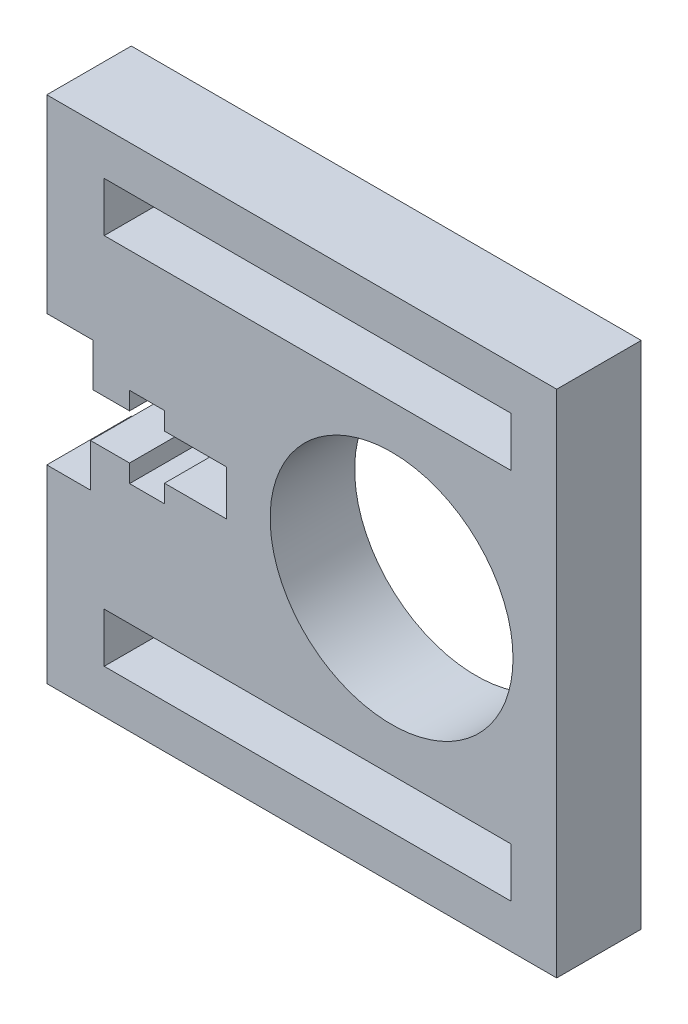
ISO-10303-21;
HEADER;
FILE_DESCRIPTION(('STEP AP214'),'2;1');
FILE_NAME('part.step','',(''),(''),'','','');
FILE_SCHEMA(('AUTOMOTIVE_DESIGN { 1 0 10303 214 1 1 1 1 }'));
ENDSEC;
DATA;
#1=APPLICATION_CONTEXT('core data for automotive mechanical design processes');
#2=APPLICATION_PROTOCOL_DEFINITION('international standard','automotive_design',2000,#1);
#3=PRODUCT_CONTEXT('',#1,'mechanical');
#4=PRODUCT('Part','Part','',(#3));
#5=PRODUCT_RELATED_PRODUCT_CATEGORY('part','',(#4));
#6=PRODUCT_DEFINITION_FORMATION('','',#4);
#7=PRODUCT_DEFINITION_CONTEXT('part definition',#1,'design');
#8=PRODUCT_DEFINITION('design','',#6,#7);
#9=PRODUCT_DEFINITION_SHAPE('','',#8);
#10=(LENGTH_UNIT() NAMED_UNIT(*) SI_UNIT(.MILLI.,.METRE.));
#11=(NAMED_UNIT(*) PLANE_ANGLE_UNIT() SI_UNIT($,.RADIAN.));
#12=(NAMED_UNIT(*) SI_UNIT($,.STERADIAN.) SOLID_ANGLE_UNIT());
#13=UNCERTAINTY_MEASURE_WITH_UNIT(LENGTH_MEASURE(1.E-05),#10,'distance_accuracy_value','');
#14=(GEOMETRIC_REPRESENTATION_CONTEXT(3) GLOBAL_UNCERTAINTY_ASSIGNED_CONTEXT((#13)) GLOBAL_UNIT_ASSIGNED_CONTEXT((#10,
#11,#12)) REPRESENTATION_CONTEXT('',''));
#15=CARTESIAN_POINT('',(0.,0.,0.));
#16=DIRECTION('',(0.,0.,1.));
#17=DIRECTION('',(1.,0.,0.));
#18=AXIS2_PLACEMENT_3D('',#15,#16,#17);
#19=CARTESIAN_POINT('',(0.,0.,5.8));
#20=DIRECTION('',(0.,0.,-1.));
#21=DIRECTION('',(-1.,0.,0.));
#22=AXIS2_PLACEMENT_3D('',#19,#20,#21);
#23=PLANE('',#22);
#24=DIRECTION('',(0.,-1.,0.));
#25=VECTOR('',#24,1.);
#26=CARTESIAN_POINT('',(-13.8445458932748,15.4844401292091,5.8));
#27=LINE('',#26,#25);
#28=CARTESIAN_POINT('',(-13.8445458932748,15.4844401292091,5.8));
#29=VERTEX_POINT('',#28);
#30=CARTESIAN_POINT('',(-13.8445458932748,12.0832558275025,5.8));
#31=VERTEX_POINT('',#30);
#32=EDGE_CURVE('E218',#29,#31,#27,.T.);
#33=ORIENTED_EDGE('',*,*,#32,.F.);
#34=DIRECTION('',(-1.,0.,0.));
#35=VECTOR('',#34,1.);
#36=CARTESIAN_POINT('',(-13.8445458932748,15.4844401292091,5.8));
#37=LINE('',#36,#35);
#38=CARTESIAN_POINT('',(14.0845681553229,15.4844401292091,5.8));
#39=VERTEX_POINT('',#38);
#40=EDGE_CURVE('E241',#39,#29,#37,.T.);
#41=ORIENTED_EDGE('',*,*,#40,.F.);
#42=DIRECTION('',(0.,1.,0.));
#43=VECTOR('',#42,1.);
#44=CARTESIAN_POINT('',(14.0845681553229,15.4844401292091,5.8));
#45=LINE('',#44,#43);
#46=CARTESIAN_POINT('',(14.0845681553229,12.0832558275025,5.8));
#47=VERTEX_POINT('',#46);
#48=EDGE_CURVE('E239',#47,#39,#45,.T.);
#49=ORIENTED_EDGE('',*,*,#48,.F.);
#50=DIRECTION('',(1.,0.,0.));
#51=VECTOR('',#50,1.);
#52=CARTESIAN_POINT('',(-13.8445458932748,12.0832558275025,5.8));
#53=LINE('',#52,#51);
#54=EDGE_CURVE('E226',#31,#47,#53,.T.);
#55=ORIENTED_EDGE('',*,*,#54,.F.);
#56=EDGE_LOOP('',(#33,#41,#49,#55));
#57=FACE_BOUND('',#56,.T.);
#58=DIRECTION('',(0.,1.,0.));
#59=VECTOR('',#58,1.);
#60=CARTESIAN_POINT('',(17.2144243268233,9.08444012920914,5.8));
#61=LINE('',#60,#59);
#62=CARTESIAN_POINT('',(17.2144243268233,9.08444012920914,5.8));
#63=VERTEX_POINT('',#62);
#64=CARTESIAN_POINT('',(17.2144243268233,44.0844401292091,5.8));
#65=VERTEX_POINT('',#64);
#66=EDGE_CURVE('E288',#63,#65,#61,.T.);
#67=ORIENTED_EDGE('',*,*,#66,.T.);
#68=DIRECTION('',(-1.,0.,0.));
#69=VECTOR('',#68,1.);
#70=CARTESIAN_POINT('',(-17.7855756731767,44.0844401292091,5.8));
#71=LINE('',#70,#69);
#72=CARTESIAN_POINT('',(-17.7855756731767,44.0844401292091,5.8));
#73=VERTEX_POINT('',#72);
#74=EDGE_CURVE('E291',#65,#73,#71,.T.);
#75=ORIENTED_EDGE('',*,*,#74,.T.);
#76=DIRECTION('',(0.,-1.,0.));
#77=VECTOR('',#76,1.);
#78=CARTESIAN_POINT('',(-17.7855756731767,31.0844401292091,5.8));
#79=LINE('',#78,#77);
#80=CARTESIAN_POINT('',(-17.7855756731767,31.0844401292091,5.8));
#81=VERTEX_POINT('',#80);
#82=EDGE_CURVE('E294',#73,#81,#79,.T.);
#83=ORIENTED_EDGE('',*,*,#82,.T.);
#84=DIRECTION('',(1.,0.,0.));
#85=VECTOR('',#84,1.);
#86=CARTESIAN_POINT('',(-14.6055756731767,31.0844401292091,5.8));
#87=LINE('',#86,#85);
#88=CARTESIAN_POINT('',(-14.6055756731767,31.0844401292091,5.8));
#89=VERTEX_POINT('',#88);
#90=EDGE_CURVE('E296',#81,#89,#87,.T.);
#91=ORIENTED_EDGE('',*,*,#90,.T.);
#92=DIRECTION('',(0.,-1.,0.));
#93=VECTOR('',#92,1.);
#94=CARTESIAN_POINT('',(-14.6055756731767,28.1322901292091,5.8));
#95=LINE('',#94,#93);
#96=CARTESIAN_POINT('',(-14.6055756731767,28.1322901292091,5.8));
#97=VERTEX_POINT('',#96);
#98=EDGE_CURVE('E298',#89,#97,#95,.T.);
#99=ORIENTED_EDGE('',*,*,#98,.T.);
#100=DIRECTION('',(1.,0.,0.));
#101=VECTOR('',#100,1.);
#102=CARTESIAN_POINT('',(-12.1055756731767,28.1322901292091,5.8));
#103=LINE('',#102,#101);
#104=CARTESIAN_POINT('',(-12.1055756731767,28.1322901292091,5.8));
#105=VERTEX_POINT('',#104);
#106=EDGE_CURVE('E300',#97,#105,#103,.T.);
#107=ORIENTED_EDGE('',*,*,#106,.T.);
#108=DIRECTION('',(0.,1.,0.));
#109=VECTOR('',#108,1.);
#110=CARTESIAN_POINT('',(-12.1055756731767,28.1322901292091,5.8));
#111=LINE('',#110,#109);
#112=CARTESIAN_POINT('',(-12.1055756731767,29.3566901292091,5.8));
#113=VERTEX_POINT('',#112);
#114=EDGE_CURVE('E302',#105,#113,#111,.T.);
#115=ORIENTED_EDGE('',*,*,#114,.T.);
#116=DIRECTION('',(1.,0.,0.));
#117=VECTOR('',#116,1.);
#118=CARTESIAN_POINT('',(-9.7055756731767,29.3566901292091,5.8));
#119=LINE('',#118,#117);
#120=CARTESIAN_POINT('',(-9.7055756731767,29.3566901292091,5.8));
#121=VERTEX_POINT('',#120);
#122=EDGE_CURVE('E304',#113,#121,#119,.T.);
#123=ORIENTED_EDGE('',*,*,#122,.T.);
#124=DIRECTION('',(0.,-1.,0.));
#125=VECTOR('',#124,1.);
#126=CARTESIAN_POINT('',(-9.7055756731767,28.1322901292091,5.8));
#127=LINE('',#126,#125);
#128=CARTESIAN_POINT('',(-9.7055756731767,28.1322901292091,5.8));
#129=VERTEX_POINT('',#128);
#130=EDGE_CURVE('E306',#121,#129,#127,.T.);
#131=ORIENTED_EDGE('',*,*,#130,.T.);
#132=DIRECTION('',(1.,0.,0.));
#133=VECTOR('',#132,1.);
#134=CARTESIAN_POINT('',(-9.7055756731767,28.1322901292091,5.8));
#135=LINE('',#134,#133);
#136=CARTESIAN_POINT('',(-5.45496555029504,28.1322901292091,5.8));
#137=VERTEX_POINT('',#136);
#138=EDGE_CURVE('E308',#129,#137,#135,.T.);
#139=ORIENTED_EDGE('',*,*,#138,.T.);
#140=DIRECTION('',(0.,-1.,0.));
#141=VECTOR('',#140,1.);
#142=CARTESIAN_POINT('',(-5.45496555029504,25.0365901292091,5.8));
#143=LINE('',#142,#141);
#144=CARTESIAN_POINT('',(-5.45496555029504,25.0365901292091,5.8));
#145=VERTEX_POINT('',#144);
#146=EDGE_CURVE('E310',#137,#145,#143,.T.);
#147=ORIENTED_EDGE('',*,*,#146,.T.);
#148=DIRECTION('',(-1.,0.,0.));
#149=VECTOR('',#148,1.);
#150=CARTESIAN_POINT('',(-9.7055756731767,25.0365901292091,5.8));
#151=LINE('',#150,#149);
#152=CARTESIAN_POINT('',(-9.7055756731767,25.0365901292091,5.8));
#153=VERTEX_POINT('',#152);
#154=EDGE_CURVE('E312',#145,#153,#151,.T.);
#155=ORIENTED_EDGE('',*,*,#154,.T.);
#156=DIRECTION('',(0.,-1.,0.));
#157=VECTOR('',#156,1.);
#158=CARTESIAN_POINT('',(-9.7055756731767,25.0365901292091,5.8));
#159=LINE('',#158,#157);
#160=CARTESIAN_POINT('',(-9.7055756731767,23.8121901292091,5.8));
#161=VERTEX_POINT('',#160);
#162=EDGE_CURVE('E314',#153,#161,#159,.T.);
#163=ORIENTED_EDGE('',*,*,#162,.T.);
#164=DIRECTION('',(-1.,0.,0.));
#165=VECTOR('',#164,1.);
#166=CARTESIAN_POINT('',(-9.7055756731767,23.8121901292091,5.8));
#167=LINE('',#166,#165);
#168=CARTESIAN_POINT('',(-12.1055756731767,23.8121901292091,5.8));
#169=VERTEX_POINT('',#168);
#170=EDGE_CURVE('E316',#161,#169,#167,.T.);
#171=ORIENTED_EDGE('',*,*,#170,.T.);
#172=DIRECTION('',(0.,1.,0.));
#173=VECTOR('',#172,1.);
#174=CARTESIAN_POINT('',(-12.1055756731767,25.0365901292091,5.8));
#175=LINE('',#174,#173);
#176=CARTESIAN_POINT('',(-12.1055756731767,25.0365901292091,5.8));
#177=VERTEX_POINT('',#176);
#178=EDGE_CURVE('E318',#169,#177,#175,.T.);
#179=ORIENTED_EDGE('',*,*,#178,.T.);
#180=DIRECTION('',(-1.,0.,0.));
#181=VECTOR('',#180,1.);
#182=CARTESIAN_POINT('',(-12.1055756731767,25.0365901292091,5.8));
#183=LINE('',#182,#181);
#184=CARTESIAN_POINT('',(-14.7855756731767,25.0365901292091,5.8));
#185=VERTEX_POINT('',#184);
#186=EDGE_CURVE('E320',#177,#185,#183,.T.);
#187=ORIENTED_EDGE('',*,*,#186,.T.);
#188=DIRECTION('',(0.,-1.,0.));
#189=VECTOR('',#188,1.);
#190=CARTESIAN_POINT('',(-14.7855756731767,25.0365901292091,5.8));
#191=LINE('',#190,#189);
#192=CARTESIAN_POINT('',(-14.7855756731767,22.0844401292091,5.8));
#193=VERTEX_POINT('',#192);
#194=EDGE_CURVE('E322',#185,#193,#191,.T.);
#195=ORIENTED_EDGE('',*,*,#194,.T.);
#196=DIRECTION('',(-1.,0.,0.));
#197=VECTOR('',#196,1.);
#198=CARTESIAN_POINT('',(-14.7855756731767,22.0844401292091,5.8));
#199=LINE('',#198,#197);
#200=CARTESIAN_POINT('',(-17.7855756731767,22.0844401292091,5.8));
#201=VERTEX_POINT('',#200);
#202=EDGE_CURVE('E324',#193,#201,#199,.T.);
#203=ORIENTED_EDGE('',*,*,#202,.T.);
#204=DIRECTION('',(0.,-1.,0.));
#205=VECTOR('',#204,1.);
#206=CARTESIAN_POINT('',(-17.7855756731767,22.0844401292091,5.8));
#207=LINE('',#206,#205);
#208=CARTESIAN_POINT('',(-17.7855756731767,9.08444012920914,5.8));
#209=VERTEX_POINT('',#208);
#210=EDGE_CURVE('E326',#201,#209,#207,.T.);
#211=ORIENTED_EDGE('',*,*,#210,.T.);
#212=DIRECTION('',(1.,0.,0.));
#213=VECTOR('',#212,1.);
#214=CARTESIAN_POINT('',(-17.7855756731767,9.08444012920914,5.8));
#215=LINE('',#214,#213);
#216=EDGE_CURVE('E328',#209,#63,#215,.T.);
#217=ORIENTED_EDGE('',*,*,#216,.T.);
#218=EDGE_LOOP('',(#67,#75,#83,#91,#99,#107,#115,#123,#131,#139,#147,#155,#163,#171,#179,#187,
#195,#203,#211,#217));
#219=FACE_BOUND('',#218,.T.);
#220=DIRECTION('',(1.,0.,0.));
#221=VECTOR('',#220,1.);
#222=CARTESIAN_POINT('',(-13.8445458932748,37.6844401292091,5.8));
#223=LINE('',#222,#221);
#224=CARTESIAN_POINT('',(-13.8445458932748,37.6844401292091,5.8));
#225=VERTEX_POINT('',#224);
#226=CARTESIAN_POINT('',(14.0845681553229,37.6844401292091,5.8));
#227=VERTEX_POINT('',#226);
#228=EDGE_CURVE('E257',#225,#227,#223,.T.);
#229=ORIENTED_EDGE('',*,*,#228,.F.);
#230=DIRECTION('',(0.,-1.,0.));
#231=VECTOR('',#230,1.);
#232=CARTESIAN_POINT('',(-13.8445458932748,37.6844401292091,5.8));
#233=LINE('',#232,#231);
#234=CARTESIAN_POINT('',(-13.8445458932748,41.0856244309158,5.8));
#235=VERTEX_POINT('',#234);
#236=EDGE_CURVE('E265',#235,#225,#233,.T.);
#237=ORIENTED_EDGE('',*,*,#236,.F.);
#238=DIRECTION('',(-1.,0.,0.));
#239=VECTOR('',#238,1.);
#240=CARTESIAN_POINT('',(-13.8445458932748,41.0856244309158,5.8));
#241=LINE('',#240,#239);
#242=CARTESIAN_POINT('',(14.0845681553229,41.0856244309158,5.8));
#243=VERTEX_POINT('',#242);
#244=EDGE_CURVE('E262',#243,#235,#241,.T.);
#245=ORIENTED_EDGE('',*,*,#244,.F.);
#246=DIRECTION('',(0.,1.,0.));
#247=VECTOR('',#246,1.);
#248=CARTESIAN_POINT('',(14.0845681553229,37.6844401292091,5.8));
#249=LINE('',#248,#247);
#250=EDGE_CURVE('E259',#227,#243,#249,.T.);
#251=ORIENTED_EDGE('',*,*,#250,.F.);
#252=EDGE_LOOP('',(#229,#237,#245,#251));
#253=FACE_BOUND('',#252,.T.);
#254=CARTESIAN_POINT('',(5.87972938826413,26.5844401292091,5.8));
#255=DIRECTION('',(0.,0.,1.));
#256=DIRECTION('',(1.,0.,0.));
#257=AXIS2_PLACEMENT_3D('',#254,#255,#256);
#258=ELLIPSE('',#257,8.33469493855917,8.1);
#259=CARTESIAN_POINT('',(14.2144243268233,26.5844401292091,5.8));
#260=VERTEX_POINT('',#259);
#261=EDGE_CURVE('E247',#260,#260,#258,.T.);
#262=ORIENTED_EDGE('',*,*,#261,.F.);
#263=EDGE_LOOP('',(#262));
#264=FACE_BOUND('',#263,.T.);
#265=ADVANCED_FACE('F33',(#57,#219,#253,#264),#23,.F.);
#266=CARTESIAN_POINT('',(0.,0.,0.));
#267=DIRECTION('',(0.,0.,-1.));
#268=DIRECTION('',(-1.,0.,0.));
#269=AXIS2_PLACEMENT_3D('',#266,#267,#268);
#270=PLANE('',#269);
#271=DIRECTION('',(-1.,0.,0.));
#272=VECTOR('',#271,1.);
#273=CARTESIAN_POINT('',(-13.8445458932748,15.4844401292091,0.));
#274=LINE('',#273,#272);
#275=CARTESIAN_POINT('',(14.0845681553229,15.4844401292091,0.));
#276=VERTEX_POINT('',#275);
#277=CARTESIAN_POINT('',(-13.8445458932748,15.4844401292091,0.));
#278=VERTEX_POINT('',#277);
#279=EDGE_CURVE('E227',#276,#278,#274,.T.);
#280=ORIENTED_EDGE('',*,*,#279,.T.);
#281=DIRECTION('',(0.,-1.,0.));
#282=VECTOR('',#281,1.);
#283=CARTESIAN_POINT('',(-13.8445458932748,15.4844401292091,0.));
#284=LINE('',#283,#282);
#285=CARTESIAN_POINT('',(-13.8445458932748,12.0832558275025,0.));
#286=VERTEX_POINT('',#285);
#287=EDGE_CURVE('E56',#278,#286,#284,.T.);
#288=ORIENTED_EDGE('',*,*,#287,.T.);
#289=DIRECTION('',(1.,0.,0.));
#290=VECTOR('',#289,1.);
#291=CARTESIAN_POINT('',(-13.8445458932748,12.0832558275025,0.));
#292=LINE('',#291,#290);
#293=CARTESIAN_POINT('',(14.0845681553229,12.0832558275025,0.));
#294=VERTEX_POINT('',#293);
#295=EDGE_CURVE('E233',#286,#294,#292,.T.);
#296=ORIENTED_EDGE('',*,*,#295,.T.);
#297=DIRECTION('',(0.,1.,0.));
#298=VECTOR('',#297,1.);
#299=CARTESIAN_POINT('',(14.0845681553229,15.4844401292091,0.));
#300=LINE('',#299,#298);
#301=EDGE_CURVE('E249',#294,#276,#300,.T.);
#302=ORIENTED_EDGE('',*,*,#301,.T.);
#303=EDGE_LOOP('',(#280,#288,#296,#302));
#304=FACE_BOUND('',#303,.T.);
#305=DIRECTION('',(0.,1.,0.));
#306=VECTOR('',#305,1.);
#307=CARTESIAN_POINT('',(17.2144243268233,9.08444012920914,0.));
#308=LINE('',#307,#306);
#309=CARTESIAN_POINT('',(17.2144243268233,9.08444012920914,0.));
#310=VERTEX_POINT('',#309);
#311=CARTESIAN_POINT('',(17.2144243268233,44.0844401292091,0.));
#312=VERTEX_POINT('',#311);
#313=EDGE_CURVE('E287',#310,#312,#308,.T.);
#314=ORIENTED_EDGE('',*,*,#313,.F.);
#315=DIRECTION('',(1.,0.,0.));
#316=VECTOR('',#315,1.);
#317=CARTESIAN_POINT('',(-17.7855756731767,9.08444012920914,0.));
#318=LINE('',#317,#316);
#319=CARTESIAN_POINT('',(-17.7855756731767,9.08444012920914,0.));
#320=VERTEX_POINT('',#319);
#321=EDGE_CURVE('E292',#320,#310,#318,.T.);
#322=ORIENTED_EDGE('',*,*,#321,.F.);
#323=DIRECTION('',(0.,-1.,0.));
#324=VECTOR('',#323,1.);
#325=CARTESIAN_POINT('',(-17.7855756731767,22.0844401292091,0.));
#326=LINE('',#325,#324);
#327=CARTESIAN_POINT('',(-17.7855756731767,22.0844401292091,0.));
#328=VERTEX_POINT('',#327);
#329=EDGE_CURVE('E367',#328,#320,#326,.T.);
#330=ORIENTED_EDGE('',*,*,#329,.F.);
#331=DIRECTION('',(-1.,0.,0.));
#332=VECTOR('',#331,1.);
#333=CARTESIAN_POINT('',(-14.7855756731767,22.0844401292091,0.));
#334=LINE('',#333,#332);
#335=CARTESIAN_POINT('',(-14.7855756731767,22.0844401292091,0.));
#336=VERTEX_POINT('',#335);
#337=EDGE_CURVE('E365',#336,#328,#334,.T.);
#338=ORIENTED_EDGE('',*,*,#337,.F.);
#339=DIRECTION('',(0.,-1.,0.));
#340=VECTOR('',#339,1.);
#341=CARTESIAN_POINT('',(-14.7855756731767,25.0365901292091,0.));
#342=LINE('',#341,#340);
#343=CARTESIAN_POINT('',(-14.7855756731767,25.0365901292091,0.));
#344=VERTEX_POINT('',#343);
#345=EDGE_CURVE('E363',#344,#336,#342,.T.);
#346=ORIENTED_EDGE('',*,*,#345,.F.);
#347=DIRECTION('',(-1.,0.,0.));
#348=VECTOR('',#347,1.);
#349=CARTESIAN_POINT('',(-12.1055756731767,25.0365901292091,0.));
#350=LINE('',#349,#348);
#351=CARTESIAN_POINT('',(-12.1055756731767,25.0365901292091,0.));
#352=VERTEX_POINT('',#351);
#353=EDGE_CURVE('E361',#352,#344,#350,.T.);
#354=ORIENTED_EDGE('',*,*,#353,.F.);
#355=DIRECTION('',(0.,1.,0.));
#356=VECTOR('',#355,1.);
#357=CARTESIAN_POINT('',(-12.1055756731767,25.0365901292091,0.));
#358=LINE('',#357,#356);
#359=CARTESIAN_POINT('',(-12.1055756731767,23.8121901292091,0.));
#360=VERTEX_POINT('',#359);
#361=EDGE_CURVE('E359',#360,#352,#358,.T.);
#362=ORIENTED_EDGE('',*,*,#361,.F.);
#363=DIRECTION('',(-1.,0.,0.));
#364=VECTOR('',#363,1.);
#365=CARTESIAN_POINT('',(-9.7055756731767,23.8121901292091,0.));
#366=LINE('',#365,#364);
#367=CARTESIAN_POINT('',(-9.7055756731767,23.8121901292091,0.));
#368=VERTEX_POINT('',#367);
#369=EDGE_CURVE('E357',#368,#360,#366,.T.);
#370=ORIENTED_EDGE('',*,*,#369,.F.);
#371=DIRECTION('',(0.,-1.,0.));
#372=VECTOR('',#371,1.);
#373=CARTESIAN_POINT('',(-9.7055756731767,25.0365901292091,0.));
#374=LINE('',#373,#372);
#375=CARTESIAN_POINT('',(-9.7055756731767,25.0365901292091,0.));
#376=VERTEX_POINT('',#375);
#377=EDGE_CURVE('E355',#376,#368,#374,.T.);
#378=ORIENTED_EDGE('',*,*,#377,.F.);
#379=DIRECTION('',(-1.,0.,0.));
#380=VECTOR('',#379,1.);
#381=CARTESIAN_POINT('',(-9.7055756731767,25.0365901292091,0.));
#382=LINE('',#381,#380);
#383=CARTESIAN_POINT('',(-5.45496555029504,25.0365901292091,0.));
#384=VERTEX_POINT('',#383);
#385=EDGE_CURVE('E353',#384,#376,#382,.T.);
#386=ORIENTED_EDGE('',*,*,#385,.F.);
#387=DIRECTION('',(0.,-1.,0.));
#388=VECTOR('',#387,1.);
#389=CARTESIAN_POINT('',(-5.45496555029504,25.0365901292091,0.));
#390=LINE('',#389,#388);
#391=CARTESIAN_POINT('',(-5.45496555029504,28.1322901292091,0.));
#392=VERTEX_POINT('',#391);
#393=EDGE_CURVE('E351',#392,#384,#390,.T.);
#394=ORIENTED_EDGE('',*,*,#393,.F.);
#395=DIRECTION('',(1.,0.,0.));
#396=VECTOR('',#395,1.);
#397=CARTESIAN_POINT('',(-9.7055756731767,28.1322901292091,0.));
#398=LINE('',#397,#396);
#399=CARTESIAN_POINT('',(-9.7055756731767,28.1322901292091,0.));
#400=VERTEX_POINT('',#399);
#401=EDGE_CURVE('E349',#400,#392,#398,.T.);
#402=ORIENTED_EDGE('',*,*,#401,.F.);
#403=DIRECTION('',(0.,-1.,0.));
#404=VECTOR('',#403,1.);
#405=CARTESIAN_POINT('',(-9.7055756731767,28.1322901292091,0.));
#406=LINE('',#405,#404);
#407=CARTESIAN_POINT('',(-9.7055756731767,29.3566901292091,0.));
#408=VERTEX_POINT('',#407);
#409=EDGE_CURVE('E347',#408,#400,#406,.T.);
#410=ORIENTED_EDGE('',*,*,#409,.F.);
#411=DIRECTION('',(1.,0.,0.));
#412=VECTOR('',#411,1.);
#413=CARTESIAN_POINT('',(-9.7055756731767,29.3566901292091,0.));
#414=LINE('',#413,#412);
#415=CARTESIAN_POINT('',(-12.1055756731767,29.3566901292091,0.));
#416=VERTEX_POINT('',#415);
#417=EDGE_CURVE('E345',#416,#408,#414,.T.);
#418=ORIENTED_EDGE('',*,*,#417,.F.);
#419=DIRECTION('',(0.,1.,0.));
#420=VECTOR('',#419,1.);
#421=CARTESIAN_POINT('',(-12.1055756731767,28.1322901292091,0.));
#422=LINE('',#421,#420);
#423=CARTESIAN_POINT('',(-12.1055756731767,28.1322901292091,0.));
#424=VERTEX_POINT('',#423);
#425=EDGE_CURVE('E343',#424,#416,#422,.T.);
#426=ORIENTED_EDGE('',*,*,#425,.F.);
#427=DIRECTION('',(1.,0.,0.));
#428=VECTOR('',#427,1.);
#429=CARTESIAN_POINT('',(-12.1055756731767,28.1322901292091,0.));
#430=LINE('',#429,#428);
#431=CARTESIAN_POINT('',(-14.6055756731767,28.1322901292091,0.));
#432=VERTEX_POINT('',#431);
#433=EDGE_CURVE('E341',#432,#424,#430,.T.);
#434=ORIENTED_EDGE('',*,*,#433,.F.);
#435=DIRECTION('',(0.,-1.,0.));
#436=VECTOR('',#435,1.);
#437=CARTESIAN_POINT('',(-14.6055756731767,28.1322901292091,0.));
#438=LINE('',#437,#436);
#439=CARTESIAN_POINT('',(-14.6055756731767,31.0844401292091,0.));
#440=VERTEX_POINT('',#439);
#441=EDGE_CURVE('E339',#440,#432,#438,.T.);
#442=ORIENTED_EDGE('',*,*,#441,.F.);
#443=DIRECTION('',(1.,0.,0.));
#444=VECTOR('',#443,1.);
#445=CARTESIAN_POINT('',(-14.6055756731767,31.0844401292091,0.));
#446=LINE('',#445,#444);
#447=CARTESIAN_POINT('',(-17.7855756731767,31.0844401292091,0.));
#448=VERTEX_POINT('',#447);
#449=EDGE_CURVE('E337',#448,#440,#446,.T.);
#450=ORIENTED_EDGE('',*,*,#449,.F.);
#451=DIRECTION('',(0.,-1.,0.));
#452=VECTOR('',#451,1.);
#453=CARTESIAN_POINT('',(-17.7855756731767,31.0844401292091,0.));
#454=LINE('',#453,#452);
#455=CARTESIAN_POINT('',(-17.7855756731767,44.0844401292091,0.));
#456=VERTEX_POINT('',#455);
#457=EDGE_CURVE('E335',#456,#448,#454,.T.);
#458=ORIENTED_EDGE('',*,*,#457,.F.);
#459=DIRECTION('',(-1.,0.,0.));
#460=VECTOR('',#459,1.);
#461=CARTESIAN_POINT('',(-17.7855756731767,44.0844401292091,0.));
#462=LINE('',#461,#460);
#463=EDGE_CURVE('E333',#312,#456,#462,.T.);
#464=ORIENTED_EDGE('',*,*,#463,.F.);
#465=EDGE_LOOP('',(#314,#322,#330,#338,#346,#354,#362,#370,#378,#386,#394,#402,#410,#418,#426,
#434,#442,#450,#458,#464));
#466=FACE_BOUND('',#465,.T.);
#467=DIRECTION('',(0.,-1.,0.));
#468=VECTOR('',#467,1.);
#469=CARTESIAN_POINT('',(-13.8445458932748,37.6844401292091,0.));
#470=LINE('',#469,#468);
#471=CARTESIAN_POINT('',(-13.8445458932748,41.0856244309158,0.));
#472=VERTEX_POINT('',#471);
#473=CARTESIAN_POINT('',(-13.8445458932748,37.6844401292091,0.));
#474=VERTEX_POINT('',#473);
#475=EDGE_CURVE('E260',#472,#474,#470,.T.);
#476=ORIENTED_EDGE('',*,*,#475,.T.);
#477=DIRECTION('',(1.,0.,0.));
#478=VECTOR('',#477,1.);
#479=CARTESIAN_POINT('',(-13.8445458932748,37.6844401292091,0.));
#480=LINE('',#479,#478);
#481=CARTESIAN_POINT('',(14.0845681553229,37.6844401292091,0.));
#482=VERTEX_POINT('',#481);
#483=EDGE_CURVE('E234',#474,#482,#480,.T.);
#484=ORIENTED_EDGE('',*,*,#483,.T.);
#485=DIRECTION('',(0.,1.,0.));
#486=VECTOR('',#485,1.);
#487=CARTESIAN_POINT('',(14.0845681553229,37.6844401292091,0.));
#488=LINE('',#487,#486);
#489=CARTESIAN_POINT('',(14.0845681553229,41.0856244309158,0.));
#490=VERTEX_POINT('',#489);
#491=EDGE_CURVE('E270',#482,#490,#488,.T.);
#492=ORIENTED_EDGE('',*,*,#491,.T.);
#493=DIRECTION('',(-1.,0.,0.));
#494=VECTOR('',#493,1.);
#495=CARTESIAN_POINT('',(-13.8445458932748,41.0856244309158,0.));
#496=LINE('',#495,#494);
#497=EDGE_CURVE('E273',#490,#472,#496,.T.);
#498=ORIENTED_EDGE('',*,*,#497,.T.);
#499=EDGE_LOOP('',(#476,#484,#492,#498));
#500=FACE_BOUND('',#499,.T.);
#501=CARTESIAN_POINT('',(5.87972938826413,26.5844401292091,0.));
#502=DIRECTION('',(0.,0.,1.));
#503=DIRECTION('',(1.,0.,0.));
#504=AXIS2_PLACEMENT_3D('',#501,#502,#503);
#505=ELLIPSE('',#504,8.33469493855917,8.1);
#506=CARTESIAN_POINT('',(14.2144243268233,26.5844401292091,0.));
#507=VERTEX_POINT('',#506);
#508=EDGE_CURVE('E788',#507,#507,#505,.T.);
#509=ORIENTED_EDGE('',*,*,#508,.T.);
#510=EDGE_LOOP('',(#509));
#511=FACE_BOUND('',#510,.T.);
#512=ADVANCED_FACE('F433',(#304,#466,#500,#511),#270,.T.);
#513=CARTESIAN_POINT('',(17.2144243268233,9.08444012920914,5.8));
#514=DIRECTION('',(-1.,0.,0.));
#515=DIRECTION('',(0.,0.,1.));
#516=AXIS2_PLACEMENT_3D('',#513,#514,#515);
#517=PLANE('',#516);
#518=ORIENTED_EDGE('',*,*,#313,.T.);
#519=DIRECTION('',(0.,0.,-1.));
#520=VECTOR('',#519,1.);
#521=CARTESIAN_POINT('',(17.2144243268233,44.0844401292091,5.8));
#522=LINE('',#521,#520);
#523=EDGE_CURVE('E11',#65,#312,#522,.T.);
#524=ORIENTED_EDGE('',*,*,#523,.F.);
#525=ORIENTED_EDGE('',*,*,#66,.F.);
#526=DIRECTION('',(0.,0.,-1.));
#527=VECTOR('',#526,1.);
#528=CARTESIAN_POINT('',(17.2144243268233,9.08444012920914,5.8));
#529=LINE('',#528,#527);
#530=EDGE_CURVE('E330',#63,#310,#529,.T.);
#531=ORIENTED_EDGE('',*,*,#530,.T.);
#532=EDGE_LOOP('',(#518,#524,#525,#531));
#533=FACE_BOUND('',#532,.T.);
#534=ADVANCED_FACE('F35',(#533),#517,.F.);
#535=CARTESIAN_POINT('',(-17.7855756731767,44.0844401292091,5.8));
#536=DIRECTION('',(0.,-1.,0.));
#537=DIRECTION('',(0.,0.,-1.));
#538=AXIS2_PLACEMENT_3D('',#535,#536,#537);
#539=PLANE('',#538);
#540=ORIENTED_EDGE('',*,*,#463,.T.);
#541=DIRECTION('',(0.,0.,-1.));
#542=VECTOR('',#541,1.);
#543=CARTESIAN_POINT('',(-17.7855756731767,44.0844401292091,5.8));
#544=LINE('',#543,#542);
#545=EDGE_CURVE('E41',#73,#456,#544,.T.);
#546=ORIENTED_EDGE('',*,*,#545,.F.);
#547=ORIENTED_EDGE('',*,*,#74,.F.);
#548=ORIENTED_EDGE('',*,*,#523,.T.);
#549=EDGE_LOOP('',(#540,#546,#547,#548));
#550=FACE_BOUND('',#549,.T.);
#551=ADVANCED_FACE('F450',(#550),#539,.F.);
#552=CARTESIAN_POINT('',(-17.7855756731767,31.0844401292091,5.8));
#553=DIRECTION('',(1.,0.,0.));
#554=DIRECTION('',(0.,0.,-1.));
#555=AXIS2_PLACEMENT_3D('',#552,#553,#554);
#556=PLANE('',#555);
#557=ORIENTED_EDGE('',*,*,#457,.T.);
#558=DIRECTION('',(0.,0.,-1.));
#559=VECTOR('',#558,1.);
#560=CARTESIAN_POINT('',(-17.7855756731767,31.0844401292091,5.8));
#561=LINE('',#560,#559);
#562=EDGE_CURVE('E420',#81,#448,#561,.T.);
#563=ORIENTED_EDGE('',*,*,#562,.F.);
#564=ORIENTED_EDGE('',*,*,#82,.F.);
#565=ORIENTED_EDGE('',*,*,#545,.T.);
#566=EDGE_LOOP('',(#557,#563,#564,#565));
#567=FACE_BOUND('',#566,.T.);
#568=ADVANCED_FACE('F427',(#567),#556,.F.);
#569=CARTESIAN_POINT('',(-14.6055756731767,31.0844401292091,5.8));
#570=DIRECTION('',(0.,1.,0.));
#571=DIRECTION('',(0.,0.,1.));
#572=AXIS2_PLACEMENT_3D('',#569,#570,#571);
#573=PLANE('',#572);
#574=ORIENTED_EDGE('',*,*,#449,.T.);
#575=DIRECTION('',(0.,0.,-1.));
#576=VECTOR('',#575,1.);
#577=CARTESIAN_POINT('',(-14.6055756731767,31.0844401292091,5.8));
#578=LINE('',#577,#576);
#579=EDGE_CURVE('E417',#89,#440,#578,.T.);
#580=ORIENTED_EDGE('',*,*,#579,.F.);
#581=ORIENTED_EDGE('',*,*,#90,.F.);
#582=ORIENTED_EDGE('',*,*,#562,.T.);
#583=EDGE_LOOP('',(#574,#580,#581,#582));
#584=FACE_BOUND('',#583,.T.);
#585=ADVANCED_FACE('F439',(#584),#573,.F.);
#586=CARTESIAN_POINT('',(-14.6055756731767,28.1322901292091,5.8));
#587=DIRECTION('',(1.,0.,0.));
#588=DIRECTION('',(0.,0.,-1.));
#589=AXIS2_PLACEMENT_3D('',#586,#587,#588);
#590=PLANE('',#589);
#591=ORIENTED_EDGE('',*,*,#441,.T.);
#592=DIRECTION('',(0.,0.,-1.));
#593=VECTOR('',#592,1.);
#594=CARTESIAN_POINT('',(-14.6055756731767,28.1322901292091,5.8));
#595=LINE('',#594,#593);
#596=EDGE_CURVE('E414',#97,#432,#595,.T.);
#597=ORIENTED_EDGE('',*,*,#596,.F.);
#598=ORIENTED_EDGE('',*,*,#98,.F.);
#599=ORIENTED_EDGE('',*,*,#579,.T.);
#600=EDGE_LOOP('',(#591,#597,#598,#599));
#601=FACE_BOUND('',#600,.T.);
#602=ADVANCED_FACE('F443',(#601),#590,.F.);
#603=CARTESIAN_POINT('',(-12.1055756731767,28.1322901292091,5.8));
#604=DIRECTION('',(0.,1.,0.));
#605=DIRECTION('',(-1.,0.,0.));
#606=AXIS2_PLACEMENT_3D('',#603,#604,#605);
#607=PLANE('',#606);
#608=ORIENTED_EDGE('',*,*,#433,.T.);
#609=DIRECTION('',(0.,0.,-1.));
#610=VECTOR('',#609,1.);
#611=CARTESIAN_POINT('',(-12.1055756731767,28.1322901292091,5.8));
#612=LINE('',#611,#610);
#613=EDGE_CURVE('E411',#105,#424,#612,.T.);
#614=ORIENTED_EDGE('',*,*,#613,.F.);
#615=ORIENTED_EDGE('',*,*,#106,.F.);
#616=ORIENTED_EDGE('',*,*,#596,.T.);
#617=EDGE_LOOP('',(#608,#614,#615,#616));
#618=FACE_BOUND('',#617,.T.);
#619=ADVANCED_FACE('F523',(#618),#607,.F.);
#620=CARTESIAN_POINT('',(-12.1055756731767,28.1322901292091,5.8));
#621=DIRECTION('',(-1.,0.,0.));
#622=DIRECTION('',(0.,-1.,0.));
#623=AXIS2_PLACEMENT_3D('',#620,#621,#622);
#624=PLANE('',#623);
#625=ORIENTED_EDGE('',*,*,#425,.T.);
#626=DIRECTION('',(0.,0.,-1.));
#627=VECTOR('',#626,1.);
#628=CARTESIAN_POINT('',(-12.1055756731767,29.3566901292091,5.8));
#629=LINE('',#628,#627);
#630=EDGE_CURVE('E408',#113,#416,#629,.T.);
#631=ORIENTED_EDGE('',*,*,#630,.F.);
#632=ORIENTED_EDGE('',*,*,#114,.F.);
#633=ORIENTED_EDGE('',*,*,#613,.T.);
#634=EDGE_LOOP('',(#625,#631,#632,#633));
#635=FACE_BOUND('',#634,.T.);
#636=ADVANCED_FACE('F521',(#635),#624,.F.);
#637=CARTESIAN_POINT('',(-9.7055756731767,29.3566901292091,5.8));
#638=DIRECTION('',(0.,1.,0.));
#639=DIRECTION('',(-1.,0.,0.));
#640=AXIS2_PLACEMENT_3D('',#637,#638,#639);
#641=PLANE('',#640);
#642=ORIENTED_EDGE('',*,*,#417,.T.);
#643=DIRECTION('',(0.,0.,-1.));
#644=VECTOR('',#643,1.);
#645=CARTESIAN_POINT('',(-9.7055756731767,29.3566901292091,5.8));
#646=LINE('',#645,#644);
#647=EDGE_CURVE('E405',#121,#408,#646,.T.);
#648=ORIENTED_EDGE('',*,*,#647,.F.);
#649=ORIENTED_EDGE('',*,*,#122,.F.);
#650=ORIENTED_EDGE('',*,*,#630,.T.);
#651=EDGE_LOOP('',(#642,#648,#649,#650));
#652=FACE_BOUND('',#651,.T.);
#653=ADVANCED_FACE('F516',(#652),#641,.F.);
#654=CARTESIAN_POINT('',(-9.7055756731767,28.1322901292091,5.8));
#655=DIRECTION('',(1.,0.,0.));
#656=DIRECTION('',(0.,1.,0.));
#657=AXIS2_PLACEMENT_3D('',#654,#655,#656);
#658=PLANE('',#657);
#659=ORIENTED_EDGE('',*,*,#409,.T.);
#660=DIRECTION('',(0.,0.,-1.));
#661=VECTOR('',#660,1.);
#662=CARTESIAN_POINT('',(-9.7055756731767,28.1322901292091,5.8));
#663=LINE('',#662,#661);
#664=EDGE_CURVE('E402',#129,#400,#663,.T.);
#665=ORIENTED_EDGE('',*,*,#664,.F.);
#666=ORIENTED_EDGE('',*,*,#130,.F.);
#667=ORIENTED_EDGE('',*,*,#647,.T.);
#668=EDGE_LOOP('',(#659,#665,#666,#667));
#669=FACE_BOUND('',#668,.T.);
#670=ADVANCED_FACE('F511',(#669),#658,.F.);
#671=CARTESIAN_POINT('',(-9.7055756731767,28.1322901292091,5.8));
#672=DIRECTION('',(0.,1.,0.));
#673=DIRECTION('',(-1.,0.,0.));
#674=AXIS2_PLACEMENT_3D('',#671,#672,#673);
#675=PLANE('',#674);
#676=ORIENTED_EDGE('',*,*,#401,.T.);
#677=DIRECTION('',(0.,0.,-1.));
#678=VECTOR('',#677,1.);
#679=CARTESIAN_POINT('',(-5.45496555029504,28.1322901292091,5.8));
#680=LINE('',#679,#678);
#681=EDGE_CURVE('E399',#137,#392,#680,.T.);
#682=ORIENTED_EDGE('',*,*,#681,.F.);
#683=ORIENTED_EDGE('',*,*,#138,.F.);
#684=ORIENTED_EDGE('',*,*,#664,.T.);
#685=EDGE_LOOP('',(#676,#682,#683,#684));
#686=FACE_BOUND('',#685,.T.);
#687=ADVANCED_FACE('F507',(#686),#675,.F.);
#688=CARTESIAN_POINT('',(-5.45496555029504,25.0365901292091,5.8));
#689=DIRECTION('',(1.,0.,0.));
#690=DIRECTION('',(0.,0.,-1.));
#691=AXIS2_PLACEMENT_3D('',#688,#689,#690);
#692=PLANE('',#691);
#693=ORIENTED_EDGE('',*,*,#393,.T.);
#694=DIRECTION('',(0.,0.,-1.));
#695=VECTOR('',#694,1.);
#696=CARTESIAN_POINT('',(-5.45496555029504,25.0365901292091,5.8));
#697=LINE('',#696,#695);
#698=EDGE_CURVE('E396',#145,#384,#697,.T.);
#699=ORIENTED_EDGE('',*,*,#698,.F.);
#700=ORIENTED_EDGE('',*,*,#146,.F.);
#701=ORIENTED_EDGE('',*,*,#681,.T.);
#702=EDGE_LOOP('',(#693,#699,#700,#701));
#703=FACE_BOUND('',#702,.T.);
#704=ADVANCED_FACE('F502',(#703),#692,.F.);
#705=CARTESIAN_POINT('',(-9.7055756731767,25.0365901292091,5.8));
#706=DIRECTION('',(0.,-1.,0.));
#707=DIRECTION('',(1.,0.,0.));
#708=AXIS2_PLACEMENT_3D('',#705,#706,#707);
#709=PLANE('',#708);
#710=ORIENTED_EDGE('',*,*,#385,.T.);
#711=DIRECTION('',(0.,0.,-1.));
#712=VECTOR('',#711,1.);
#713=CARTESIAN_POINT('',(-9.7055756731767,25.0365901292091,5.8));
#714=LINE('',#713,#712);
#715=EDGE_CURVE('E393',#153,#376,#714,.T.);
#716=ORIENTED_EDGE('',*,*,#715,.F.);
#717=ORIENTED_EDGE('',*,*,#154,.F.);
#718=ORIENTED_EDGE('',*,*,#698,.T.);
#719=EDGE_LOOP('',(#710,#716,#717,#718));
#720=FACE_BOUND('',#719,.T.);
#721=ADVANCED_FACE('F496',(#720),#709,.F.);
#722=CARTESIAN_POINT('',(-9.7055756731767,25.0365901292091,5.8));
#723=DIRECTION('',(1.,0.,0.));
#724=DIRECTION('',(0.,0.,-1.));
#725=AXIS2_PLACEMENT_3D('',#722,#723,#724);
#726=PLANE('',#725);
#727=ORIENTED_EDGE('',*,*,#377,.T.);
#728=DIRECTION('',(0.,0.,-1.));
#729=VECTOR('',#728,1.);
#730=CARTESIAN_POINT('',(-9.7055756731767,23.8121901292091,5.8));
#731=LINE('',#730,#729);
#732=EDGE_CURVE('E390',#161,#368,#731,.T.);
#733=ORIENTED_EDGE('',*,*,#732,.F.);
#734=ORIENTED_EDGE('',*,*,#162,.F.);
#735=ORIENTED_EDGE('',*,*,#715,.T.);
#736=EDGE_LOOP('',(#727,#733,#734,#735));
#737=FACE_BOUND('',#736,.T.);
#738=ADVANCED_FACE('F492',(#737),#726,.F.);
#739=CARTESIAN_POINT('',(-9.7055756731767,23.8121901292091,5.8));
#740=DIRECTION('',(0.,-1.,0.));
#741=DIRECTION('',(0.,0.,-1.));
#742=AXIS2_PLACEMENT_3D('',#739,#740,#741);
#743=PLANE('',#742);
#744=ORIENTED_EDGE('',*,*,#369,.T.);
#745=DIRECTION('',(0.,0.,-1.));
#746=VECTOR('',#745,1.);
#747=CARTESIAN_POINT('',(-12.1055756731767,23.8121901292091,5.8));
#748=LINE('',#747,#746);
#749=EDGE_CURVE('E387',#169,#360,#748,.T.);
#750=ORIENTED_EDGE('',*,*,#749,.F.);
#751=ORIENTED_EDGE('',*,*,#170,.F.);
#752=ORIENTED_EDGE('',*,*,#732,.T.);
#753=EDGE_LOOP('',(#744,#750,#751,#752));
#754=FACE_BOUND('',#753,.T.);
#755=ADVANCED_FACE('F487',(#754),#743,.F.);
#756=CARTESIAN_POINT('',(-12.1055756731767,25.0365901292091,5.8));
#757=DIRECTION('',(-1.,0.,0.));
#758=DIRECTION('',(0.,0.,1.));
#759=AXIS2_PLACEMENT_3D('',#756,#757,#758);
#760=PLANE('',#759);
#761=ORIENTED_EDGE('',*,*,#361,.T.);
#762=DIRECTION('',(0.,0.,-1.));
#763=VECTOR('',#762,1.);
#764=CARTESIAN_POINT('',(-12.1055756731767,25.0365901292091,5.8));
#765=LINE('',#764,#763);
#766=EDGE_CURVE('E384',#177,#352,#765,.T.);
#767=ORIENTED_EDGE('',*,*,#766,.F.);
#768=ORIENTED_EDGE('',*,*,#178,.F.);
#769=ORIENTED_EDGE('',*,*,#749,.T.);
#770=EDGE_LOOP('',(#761,#767,#768,#769));
#771=FACE_BOUND('',#770,.T.);
#772=ADVANCED_FACE('F481',(#771),#760,.F.);
#773=CARTESIAN_POINT('',(-12.1055756731767,25.0365901292091,5.8));
#774=DIRECTION('',(0.,-1.,0.));
#775=DIRECTION('',(1.,0.,0.));
#776=AXIS2_PLACEMENT_3D('',#773,#774,#775);
#777=PLANE('',#776);
#778=ORIENTED_EDGE('',*,*,#353,.T.);
#779=DIRECTION('',(0.,0.,-1.));
#780=VECTOR('',#779,1.);
#781=CARTESIAN_POINT('',(-14.7855756731767,25.0365901292091,5.8));
#782=LINE('',#781,#780);
#783=EDGE_CURVE('E381',#185,#344,#782,.T.);
#784=ORIENTED_EDGE('',*,*,#783,.F.);
#785=ORIENTED_EDGE('',*,*,#186,.F.);
#786=ORIENTED_EDGE('',*,*,#766,.T.);
#787=EDGE_LOOP('',(#778,#784,#785,#786));
#788=FACE_BOUND('',#787,.T.);
#789=ADVANCED_FACE('F477',(#788),#777,.F.);
#790=CARTESIAN_POINT('',(-14.7855756731767,25.0365901292091,5.8));
#791=DIRECTION('',(1.,0.,0.));
#792=DIRECTION('',(0.,0.,-1.));
#793=AXIS2_PLACEMENT_3D('',#790,#791,#792);
#794=PLANE('',#793);
#795=ORIENTED_EDGE('',*,*,#345,.T.);
#796=DIRECTION('',(0.,0.,-1.));
#797=VECTOR('',#796,1.);
#798=CARTESIAN_POINT('',(-14.7855756731767,22.0844401292091,5.8));
#799=LINE('',#798,#797);
#800=EDGE_CURVE('E378',#193,#336,#799,.T.);
#801=ORIENTED_EDGE('',*,*,#800,.F.);
#802=ORIENTED_EDGE('',*,*,#194,.F.);
#803=ORIENTED_EDGE('',*,*,#783,.T.);
#804=EDGE_LOOP('',(#795,#801,#802,#803));
#805=FACE_BOUND('',#804,.T.);
#806=ADVANCED_FACE('F472',(#805),#794,.F.);
#807=CARTESIAN_POINT('',(-14.7855756731767,22.0844401292091,5.8));
#808=DIRECTION('',(0.,-1.,0.));
#809=DIRECTION('',(0.,0.,-1.));
#810=AXIS2_PLACEMENT_3D('',#807,#808,#809);
#811=PLANE('',#810);
#812=ORIENTED_EDGE('',*,*,#337,.T.);
#813=DIRECTION('',(0.,0.,-1.));
#814=VECTOR('',#813,1.);
#815=CARTESIAN_POINT('',(-17.7855756731767,22.0844401292091,5.8));
#816=LINE('',#815,#814);
#817=EDGE_CURVE('E375',#201,#328,#816,.T.);
#818=ORIENTED_EDGE('',*,*,#817,.F.);
#819=ORIENTED_EDGE('',*,*,#202,.F.);
#820=ORIENTED_EDGE('',*,*,#800,.T.);
#821=EDGE_LOOP('',(#812,#818,#819,#820));
#822=FACE_BOUND('',#821,.T.);
#823=ADVANCED_FACE('F466',(#822),#811,.F.);
#824=CARTESIAN_POINT('',(-17.7855756731767,22.0844401292091,5.8));
#825=DIRECTION('',(1.,0.,0.));
#826=DIRECTION('',(0.,0.,-1.));
#827=AXIS2_PLACEMENT_3D('',#824,#825,#826);
#828=PLANE('',#827);
#829=ORIENTED_EDGE('',*,*,#329,.T.);
#830=DIRECTION('',(0.,0.,-1.));
#831=VECTOR('',#830,1.);
#832=CARTESIAN_POINT('',(-17.7855756731767,9.08444012920914,5.8));
#833=LINE('',#832,#831);
#834=EDGE_CURVE('E372',#209,#320,#833,.T.);
#835=ORIENTED_EDGE('',*,*,#834,.F.);
#836=ORIENTED_EDGE('',*,*,#210,.F.);
#837=ORIENTED_EDGE('',*,*,#817,.T.);
#838=EDGE_LOOP('',(#829,#835,#836,#837));
#839=FACE_BOUND('',#838,.T.);
#840=ADVANCED_FACE('F462',(#839),#828,.F.);
#841=CARTESIAN_POINT('',(-17.7855756731767,9.08444012920914,5.8));
#842=DIRECTION('',(0.,1.,0.));
#843=DIRECTION('',(0.,0.,1.));
#844=AXIS2_PLACEMENT_3D('',#841,#842,#843);
#845=PLANE('',#844);
#846=ORIENTED_EDGE('',*,*,#321,.T.);
#847=ORIENTED_EDGE('',*,*,#530,.F.);
#848=ORIENTED_EDGE('',*,*,#216,.F.);
#849=ORIENTED_EDGE('',*,*,#834,.T.);
#850=EDGE_LOOP('',(#846,#847,#848,#849));
#851=FACE_BOUND('',#850,.T.);
#852=ADVANCED_FACE('F457',(#851),#845,.F.);
#853=CARTESIAN_POINT('',(-13.8445458932748,37.6844401292091,5.8));
#854=DIRECTION('',(0.,1.,0.));
#855=DIRECTION('',(0.,0.,1.));
#856=AXIS2_PLACEMENT_3D('',#853,#854,#855);
#857=PLANE('',#856);
#858=ORIENTED_EDGE('',*,*,#483,.F.);
#859=DIRECTION('',(0.,0.,-1.));
#860=VECTOR('',#859,1.);
#861=CARTESIAN_POINT('',(-13.8445458932748,37.6844401292091,5.8));
#862=LINE('',#861,#860);
#863=EDGE_CURVE('E267',#225,#474,#862,.T.);
#864=ORIENTED_EDGE('',*,*,#863,.F.);
#865=ORIENTED_EDGE('',*,*,#228,.T.);
#866=DIRECTION('',(0.,0.,-1.));
#867=VECTOR('',#866,1.);
#868=CARTESIAN_POINT('',(14.0845681553229,37.6844401292091,5.8));
#869=LINE('',#868,#867);
#870=EDGE_CURVE('E284',#227,#482,#869,.T.);
#871=ORIENTED_EDGE('',*,*,#870,.T.);
#872=EDGE_LOOP('',(#858,#864,#865,#871));
#873=FACE_BOUND('',#872,.T.);
#874=ADVANCED_FACE('F540',(#873),#857,.T.);
#875=CARTESIAN_POINT('',(14.0845681553229,37.6844401292091,5.8));
#876=DIRECTION('',(-1.,0.,0.));
#877=DIRECTION('',(0.,-1.,0.));
#878=AXIS2_PLACEMENT_3D('',#875,#876,#877);
#879=PLANE('',#878);
#880=ORIENTED_EDGE('',*,*,#491,.F.);
#881=ORIENTED_EDGE('',*,*,#870,.F.);
#882=ORIENTED_EDGE('',*,*,#250,.T.);
#883=DIRECTION('',(0.,0.,-1.));
#884=VECTOR('',#883,1.);
#885=CARTESIAN_POINT('',(14.0845681553229,41.0856244309158,5.8));
#886=LINE('',#885,#884);
#887=EDGE_CURVE('E282',#243,#490,#886,.T.);
#888=ORIENTED_EDGE('',*,*,#887,.T.);
#889=EDGE_LOOP('',(#880,#881,#882,#888));
#890=FACE_BOUND('',#889,.T.);
#891=ADVANCED_FACE('F626',(#890),#879,.T.);
#892=CARTESIAN_POINT('',(-13.8445458932748,41.0856244309158,5.8));
#893=DIRECTION('',(0.,-1.,0.));
#894=DIRECTION('',(0.,0.,-1.));
#895=AXIS2_PLACEMENT_3D('',#892,#893,#894);
#896=PLANE('',#895);
#897=ORIENTED_EDGE('',*,*,#497,.F.);
#898=ORIENTED_EDGE('',*,*,#887,.F.);
#899=ORIENTED_EDGE('',*,*,#244,.T.);
#900=DIRECTION('',(0.,0.,-1.));
#901=VECTOR('',#900,1.);
#902=CARTESIAN_POINT('',(-13.8445458932748,41.0856244309158,5.8));
#903=LINE('',#902,#901);
#904=EDGE_CURVE('E280',#235,#472,#903,.T.);
#905=ORIENTED_EDGE('',*,*,#904,.T.);
#906=EDGE_LOOP('',(#897,#898,#899,#905));
#907=FACE_BOUND('',#906,.T.);
#908=ADVANCED_FACE('F633',(#907),#896,.T.);
#909=CARTESIAN_POINT('',(-13.8445458932748,37.6844401292091,5.8));
#910=DIRECTION('',(1.,0.,0.));
#911=DIRECTION('',(0.,1.,0.));
#912=AXIS2_PLACEMENT_3D('',#909,#910,#911);
#913=PLANE('',#912);
#914=ORIENTED_EDGE('',*,*,#475,.F.);
#915=ORIENTED_EDGE('',*,*,#904,.F.);
#916=ORIENTED_EDGE('',*,*,#236,.T.);
#917=ORIENTED_EDGE('',*,*,#863,.T.);
#918=EDGE_LOOP('',(#914,#915,#916,#917));
#919=FACE_BOUND('',#918,.T.);
#920=ADVANCED_FACE('F640',(#919),#913,.T.);
#921=CARTESIAN_POINT('',(-13.8445458932748,15.4844401292091,5.8));
#922=DIRECTION('',(1.,0.,0.));
#923=DIRECTION('',(0.,1.,0.));
#924=AXIS2_PLACEMENT_3D('',#921,#922,#923);
#925=PLANE('',#924);
#926=ORIENTED_EDGE('',*,*,#287,.F.);
#927=DIRECTION('',(0.,0.,-1.));
#928=VECTOR('',#927,1.);
#929=CARTESIAN_POINT('',(-13.8445458932748,15.4844401292091,5.8));
#930=LINE('',#929,#928);
#931=EDGE_CURVE('E222',#29,#278,#930,.T.);
#932=ORIENTED_EDGE('',*,*,#931,.F.);
#933=ORIENTED_EDGE('',*,*,#32,.T.);
#934=DIRECTION('',(0.,0.,-1.));
#935=VECTOR('',#934,1.);
#936=CARTESIAN_POINT('',(-13.8445458932748,12.0832558275025,5.8));
#937=LINE('',#936,#935);
#938=EDGE_CURVE('E221',#31,#286,#937,.T.);
#939=ORIENTED_EDGE('',*,*,#938,.T.);
#940=EDGE_LOOP('',(#926,#932,#933,#939));
#941=FACE_BOUND('',#940,.T.);
#942=ADVANCED_FACE('F220',(#941),#925,.T.);
#943=CARTESIAN_POINT('',(-13.8445458932748,12.0832558275025,5.8));
#944=DIRECTION('',(0.,1.,0.));
#945=DIRECTION('',(0.,0.,1.));
#946=AXIS2_PLACEMENT_3D('',#943,#944,#945);
#947=PLANE('',#946);
#948=ORIENTED_EDGE('',*,*,#295,.F.);
#949=ORIENTED_EDGE('',*,*,#938,.F.);
#950=ORIENTED_EDGE('',*,*,#54,.T.);
#951=DIRECTION('',(0.,0.,-1.));
#952=VECTOR('',#951,1.);
#953=CARTESIAN_POINT('',(14.0845681553229,12.0832558275025,5.8));
#954=LINE('',#953,#952);
#955=EDGE_CURVE('E235',#47,#294,#954,.T.);
#956=ORIENTED_EDGE('',*,*,#955,.T.);
#957=EDGE_LOOP('',(#948,#949,#950,#956));
#958=FACE_BOUND('',#957,.T.);
#959=ADVANCED_FACE('F230',(#958),#947,.T.);
#960=CARTESIAN_POINT('',(14.0845681553229,15.4844401292091,5.8));
#961=DIRECTION('',(-1.,0.,0.));
#962=DIRECTION('',(0.,-1.,0.));
#963=AXIS2_PLACEMENT_3D('',#960,#961,#962);
#964=PLANE('',#963);
#965=ORIENTED_EDGE('',*,*,#301,.F.);
#966=ORIENTED_EDGE('',*,*,#955,.F.);
#967=ORIENTED_EDGE('',*,*,#48,.T.);
#968=DIRECTION('',(0.,0.,-1.));
#969=VECTOR('',#968,1.);
#970=CARTESIAN_POINT('',(14.0845681553229,15.4844401292091,5.8));
#971=LINE('',#970,#969);
#972=EDGE_CURVE('E48',#39,#276,#971,.T.);
#973=ORIENTED_EDGE('',*,*,#972,.T.);
#974=EDGE_LOOP('',(#965,#966,#967,#973));
#975=FACE_BOUND('',#974,.T.);
#976=ADVANCED_FACE('F661',(#975),#964,.T.);
#977=CARTESIAN_POINT('',(-13.8445458932748,15.4844401292091,5.8));
#978=DIRECTION('',(0.,-1.,0.));
#979=DIRECTION('',(0.,0.,-1.));
#980=AXIS2_PLACEMENT_3D('',#977,#978,#979);
#981=PLANE('',#980);
#982=ORIENTED_EDGE('',*,*,#279,.F.);
#983=ORIENTED_EDGE('',*,*,#972,.F.);
#984=ORIENTED_EDGE('',*,*,#40,.T.);
#985=ORIENTED_EDGE('',*,*,#931,.T.);
#986=EDGE_LOOP('',(#982,#983,#984,#985));
#987=FACE_BOUND('',#986,.T.);
#988=ADVANCED_FACE('F668',(#987),#981,.T.);
#989=DIRECTION('',(0.,0.,-1.));
#990=VECTOR('',#989,1.);
#991=SURFACE_OF_LINEAR_EXTRUSION('',#258,#990);
#992=ORIENTED_EDGE('',*,*,#261,.T.);
#993=EDGE_LOOP('',(#992));
#994=FACE_BOUND('',#993,.T.);
#995=ORIENTED_EDGE('',*,*,#508,.F.);
#996=EDGE_LOOP('',(#995));
#997=FACE_BOUND('',#996,.T.);
#998=ADVANCED_FACE('F676',(#994,#997),#991,.T.);
#999=CLOSED_SHELL('',(#265,#512,#534,#551,#568,#585,#602,#619,#636,#653,#670,#687,#704,#721,
#738,#755,#772,#789,#806,#823,#840,#852,#874,#891,#908,#920,#942,#959,#976,#988,#998));
#1000=MANIFOLD_SOLID_BREP('B2',#999);
#1001=ADVANCED_BREP_SHAPE_REPRESENTATION('',(#18,#1000),#14);
#1002=SHAPE_DEFINITION_REPRESENTATION(#9,#1001);
ENDSEC;
END-ISO-10303-21;
